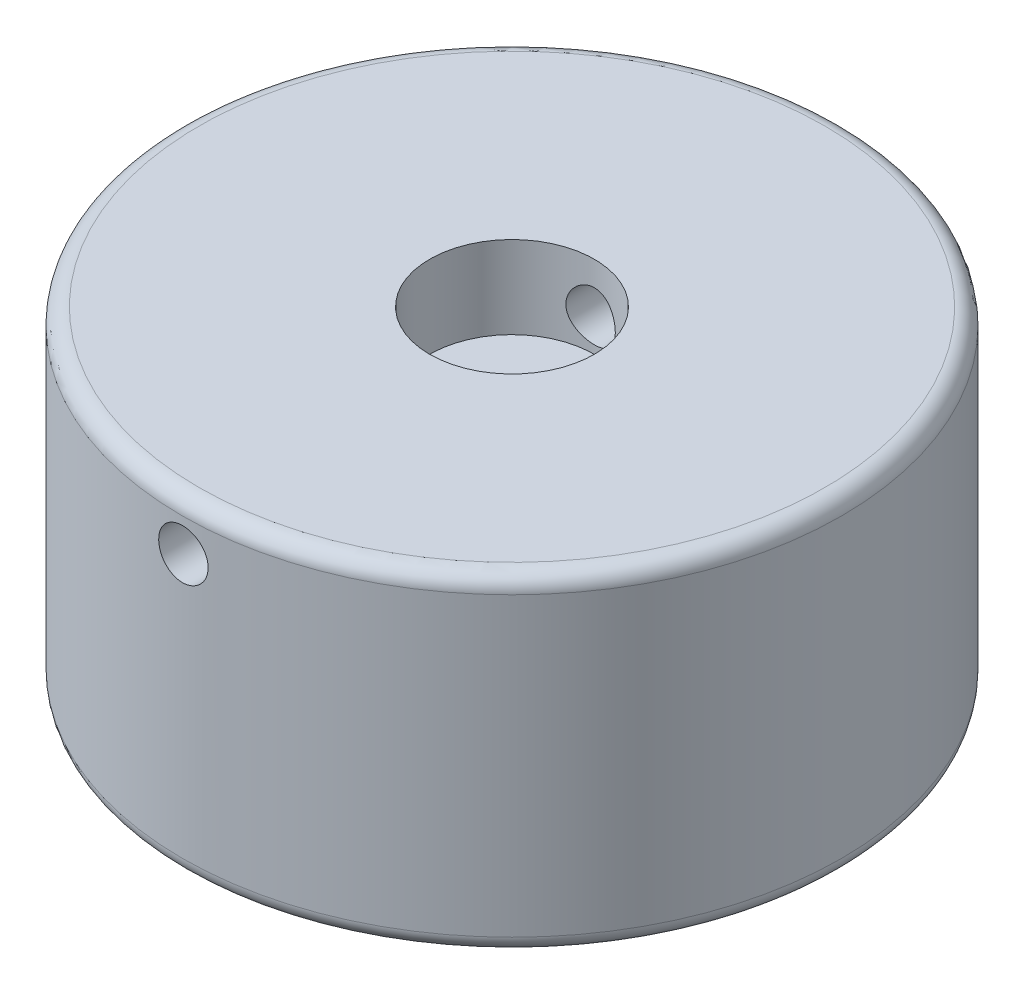
ISO-10303-21;
HEADER;
FILE_DESCRIPTION(('STEP AP214'),'2;1');
FILE_NAME('part.step','',(''),(''),'','','');
FILE_SCHEMA(('AUTOMOTIVE_DESIGN { 1 0 10303 214 1 1 1 1 }'));
ENDSEC;
DATA;
#1=APPLICATION_CONTEXT('core data for automotive mechanical design processes');
#2=APPLICATION_PROTOCOL_DEFINITION('international standard','automotive_design',2000,#1);
#3=PRODUCT_CONTEXT('',#1,'mechanical');
#4=PRODUCT('Part','Part','',(#3));
#5=PRODUCT_RELATED_PRODUCT_CATEGORY('part','',(#4));
#6=PRODUCT_DEFINITION_FORMATION('','',#4);
#7=PRODUCT_DEFINITION_CONTEXT('part definition',#1,'design');
#8=PRODUCT_DEFINITION('design','',#6,#7);
#9=PRODUCT_DEFINITION_SHAPE('','',#8);
#10=(LENGTH_UNIT() NAMED_UNIT(*) SI_UNIT(.MILLI.,.METRE.));
#11=(NAMED_UNIT(*) PLANE_ANGLE_UNIT() SI_UNIT($,.RADIAN.));
#12=(NAMED_UNIT(*) SI_UNIT($,.STERADIAN.) SOLID_ANGLE_UNIT());
#13=UNCERTAINTY_MEASURE_WITH_UNIT(LENGTH_MEASURE(1.E-05),#10,'distance_accuracy_value','');
#14=(GEOMETRIC_REPRESENTATION_CONTEXT(3) GLOBAL_UNCERTAINTY_ASSIGNED_CONTEXT((#13)) GLOBAL_UNIT_ASSIGNED_CONTEXT((#10,
#11,#12)) REPRESENTATION_CONTEXT('',''));
#15=CARTESIAN_POINT('',(0.,0.,0.));
#16=DIRECTION('',(0.,0.,1.));
#17=DIRECTION('',(1.,0.,0.));
#18=AXIS2_PLACEMENT_3D('',#15,#16,#17);
#19=CARTESIAN_POINT('',(0.,20.,0.));
#20=DIRECTION('',(0.,-1.,0.));
#21=DIRECTION('',(0.,0.,-1.));
#22=AXIS2_PLACEMENT_3D('',#19,#20,#21);
#23=CYLINDRICAL_SURFACE('',#22,20.);
#24=CARTESIAN_POINT('',(0.,19.,0.));
#25=DIRECTION('',(0.,1.,0.));
#26=DIRECTION('',(0.,0.,1.));
#27=AXIS2_PLACEMENT_3D('',#24,#25,#26);
#28=CIRCLE('',#27,20.);
#29=CARTESIAN_POINT('',(0.,19.,20.));
#30=VERTEX_POINT('',#29);
#31=EDGE_CURVE('E10',#30,#30,#28,.F.);
#32=ORIENTED_EDGE('',*,*,#31,.T.);
#33=EDGE_LOOP('',(#32));
#34=FACE_BOUND('',#33,.T.);
#35=CARTESIAN_POINT('',(0.,1.,0.));
#36=DIRECTION('',(0.,1.,0.));
#37=DIRECTION('',(0.,0.,1.));
#38=AXIS2_PLACEMENT_3D('',#35,#36,#37);
#39=CIRCLE('',#38,20.);
#40=CARTESIAN_POINT('',(0.,1.,20.));
#41=VERTEX_POINT('',#40);
#42=EDGE_CURVE('E46',#41,#41,#39,.T.);
#43=ORIENTED_EDGE('',*,*,#42,.T.);
#44=EDGE_LOOP('',(#43));
#45=FACE_BOUND('',#44,.T.);
#46=CARTESIAN_POINT('',(0.,18.5,-20.));
#47=CARTESIAN_POINT('',(-0.0841288095114436,18.499996313183,-19.9999992582729));
#48=CARTESIAN_POINT('',(-0.168315601024088,18.4928985465594,-19.9994635090758));
#49=CARTESIAN_POINT('',(-0.334361941971539,18.4646875154567,-19.9973778078798));
#50=CARTESIAN_POINT('',(-0.416218711162995,18.443558183763,-19.9958266932389));
#51=CARTESIAN_POINT('',(-0.575175965959819,18.3878966718803,-19.9918856268593));
#52=CARTESIAN_POINT('',(-0.652279036935093,18.3533718528915,-19.9894961359011));
#53=CARTESIAN_POINT('',(-0.799576480678021,18.2719120471363,-19.9841466247064));
#54=CARTESIAN_POINT('',(-0.869772371799852,18.224979796204,-19.9811867302827));
#55=CARTESIAN_POINT('',(-1.00142895753255,18.1199307794625,-19.975021868989));
#56=CARTESIAN_POINT('',(-1.06287322971853,18.0617934559158,-19.971816458291));
#57=CARTESIAN_POINT('',(-1.17514165369782,17.9360277026551,-19.9655255838438));
#58=CARTESIAN_POINT('',(-1.22596534904266,17.8683988652259,-19.9624401252546));
#59=CARTESIAN_POINT('',(-1.31560383874766,17.7254725451906,-19.9567335395977));
#60=CARTESIAN_POINT('',(-1.35440446810332,17.6501661549699,-19.954112961772));
#61=CARTESIAN_POINT('',(-1.41880489046782,17.4940846276562,-19.9496376121017));
#62=CARTESIAN_POINT('',(-1.44440487688688,17.4133095707074,-19.947782829037));
#63=CARTESIAN_POINT('',(-1.48163037657928,17.2487461075994,-19.9450525889002));
#64=CARTESIAN_POINT('',(-1.49328231044217,17.1649637091924,-19.9441752805014));
#65=CARTESIAN_POINT('',(-1.50236254574838,16.9966280467393,-19.9434933892539));
#66=CARTESIAN_POINT('',(-1.49979106810858,16.9120747946865,-19.943688789744));
#67=CARTESIAN_POINT('',(-1.48051934417569,16.7447781889461,-19.9451285636931));
#68=CARTESIAN_POINT('',(-1.46384775676394,16.6620315130358,-19.9463708093904));
#69=CARTESIAN_POINT('',(-1.4168935522692,16.5005143028844,-19.9497609519804));
#70=CARTESIAN_POINT('',(-1.38661082447336,16.4217438009912,-19.9519088562398));
#71=CARTESIAN_POINT('',(-1.31326167189701,16.2703232837612,-19.9568707353614));
#72=CARTESIAN_POINT('',(-1.27018232726496,16.1976795498232,-19.9596853828031));
#73=CARTESIAN_POINT('',(-1.17247213743423,16.0606433371351,-19.9656629459514));
#74=CARTESIAN_POINT('',(-1.11784110342877,15.9962509932777,-19.9688258673499));
#75=CARTESIAN_POINT('',(-0.998417278432273,15.8773787417564,-19.9751530336147));
#76=CARTESIAN_POINT('',(-0.933599700176313,15.8229237324053,-19.978317262423));
#77=CARTESIAN_POINT('',(-0.79572937593444,15.7256642364343,-19.9842830152099));
#78=CARTESIAN_POINT('',(-0.722676625718588,15.6828597557987,-19.9870845390023));
#79=CARTESIAN_POINT('',(-0.57039394021633,15.6101181697562,-19.9920096041928));
#80=CARTESIAN_POINT('',(-0.491163509428973,15.5801820977587,-19.994133091137));
#81=CARTESIAN_POINT('',(-0.328781652774538,15.5340441877952,-19.9974621500133));
#82=CARTESIAN_POINT('',(-0.245630292842568,15.5178421189623,-19.998667737375));
#83=CARTESIAN_POINT('',(-0.0779828437837463,15.4996631904611,-20.0000231735387));
#84=CARTESIAN_POINT('',(0.00650949482532519,15.4976519253458,-20.0001755757578));
#85=CARTESIAN_POINT('',(0.174630230993068,15.5078216680697,-19.9994142771364));
#86=CARTESIAN_POINT('',(0.258258635054601,15.5200025690053,-19.9985005843262));
#87=CARTESIAN_POINT('',(0.422180011176508,15.5581823688106,-19.9957115375324));
#88=CARTESIAN_POINT('',(0.502476701646074,15.5841653905587,-19.9938372886011));
#89=CARTESIAN_POINT('',(0.657570327384032,15.6491956936367,-19.989337809084));
#90=CARTESIAN_POINT('',(0.732367191799401,15.6882431432368,-19.9867125688255));
#91=CARTESIAN_POINT('',(0.874494959376764,15.7783808378979,-19.9809993255836));
#92=CARTESIAN_POINT('',(0.941811320255552,15.8294939567188,-19.9779104477497));
#93=CARTESIAN_POINT('',(1.06692059601702,15.9422789254691,-19.9716201639251));
#94=CARTESIAN_POINT('',(1.12471337673481,16.0039509241233,-19.9684187563498));
#95=CARTESIAN_POINT('',(1.22925234979154,16.1362519401321,-19.9622567375937));
#96=CARTESIAN_POINT('',(1.27597614708766,16.206898679433,-19.9592966224009));
#97=CARTESIAN_POINT('',(1.35689744472608,16.3550551983815,-19.9539590285433));
#98=CARTESIAN_POINT('',(1.39109504958689,16.4325649207578,-19.951581545017));
#99=CARTESIAN_POINT('',(1.44595479238458,16.5921668074873,-19.9476809567371));
#100=CARTESIAN_POINT('',(1.46663080672911,16.6742541798527,-19.9461569763152));
#101=CARTESIAN_POINT('',(1.49390569339177,16.8407472310157,-19.9441328652441));
#102=CARTESIAN_POINT('',(1.50050477907388,16.9251528746556,-19.9436327190765));
#103=CARTESIAN_POINT('',(1.49943621553155,17.0936639132474,-19.9437130691626));
#104=CARTESIAN_POINT('',(1.49180376085723,17.1777695348961,-19.9442908995857));
#105=CARTESIAN_POINT('',(1.46256198193398,17.34350108371,-19.9464564369575));
#106=CARTESIAN_POINT('',(1.44095263443385,17.4251270067498,-19.9480441455862));
#107=CARTESIAN_POINT('',(1.38437900273526,17.5835856084218,-19.952049853556));
#108=CARTESIAN_POINT('',(1.34941515840954,17.6604184448325,-19.9544678255495));
#109=CARTESIAN_POINT('',(1.26712924619683,17.8071289577146,-19.9598616237908));
#110=CARTESIAN_POINT('',(1.21980742681008,17.8770067740018,-19.9628374388208));
#111=CARTESIAN_POINT('',(1.11401708946727,18.008003349971,-19.9690203079162));
#112=CARTESIAN_POINT('',(1.05552268820001,18.0691011816401,-19.972227887963));
#113=CARTESIAN_POINT('',(0.929090973452715,18.1806340503108,-19.9785081329158));
#114=CARTESIAN_POINT('',(0.861151367795684,18.2310664915061,-19.9815807648333));
#115=CARTESIAN_POINT('',(0.717650416603836,18.3198911625391,-19.9872494022766));
#116=CARTESIAN_POINT('',(0.642077148267442,18.358264160491,-19.9898446437752));
#117=CARTESIAN_POINT('',(0.485593917915207,18.4217282844403,-19.9942566719576));
#118=CARTESIAN_POINT('',(0.404690263737662,18.4468348030683,-19.9960743603405));
#119=CARTESIAN_POINT('',(0.269417916724366,18.476601988527,-19.9982556200579));
#120=CARTESIAN_POINT('',(0.21592119293804,18.4853647187894,-19.9989068154638));
#121=CARTESIAN_POINT('',(0.108290987947988,18.4970649051523,-19.9997792437292));
#122=CARTESIAN_POINT('',(0.0541575080690676,18.5000023733704,-20.0000004774832));
#123=CARTESIAN_POINT('',(0.,18.5,-20.));
#124=B_SPLINE_CURVE_WITH_KNOTS('',3,(#46,#47,#48,#49,#50,#51,#52,#53,#54,#55,#56,#57,#58,#59,
#60,#61,#62,#63,#64,#65,#66,#67,#68,#69,#70,#71,#72,#73,#74,#75,#76,#77,#78,#79,#80,#81,#82,#83,
#84,#85,#86,#87,#88,#89,#90,#91,#92,#93,#94,#95,#96,#97,#98,#99,#100,#101,#102,#103,#104,#105,
#106,#107,#108,#109,#110,#111,#112,#113,#114,#115,#116,#117,#118,#119,#120,#121,#122,#123),
.UNSPECIFIED.,.T.,.F.,(4,2,2,2,2,2,2,2,2,2,2,2,2,2,2,2,2,2,2,2,2,2,2,2,2,2,2,2,2,2,2,2,2,2,2,2,
2,2,4),(0.,0.252188706341404,0.504666687116077,0.757006120137035,1.00928995874569,
1.26204114133441,1.51480318436673,1.76786189721255,2.02091690224424,2.27349180470371,
2.52606278420137,2.7781216361643,3.03018253840791,3.28249879898397,3.53481918386622,
3.78776333637314,4.04070761880368,4.29367221036428,4.54663254953899,4.79897937776532,
5.05132430518305,5.3033795769523,5.55543809532427,5.8079783521194,6.06052216631006,
6.31357265115638,6.56662102450255,6.81940930006921,7.07219374409737,7.32435388202406,
7.57651443943157,7.82866669184701,8.0808138742512,8.33355244628147,8.58635246072109,
8.83955360771712,9.09246032562225,9.25480590484756,9.41715114636384),.UNSPECIFIED.);
#125=CARTESIAN_POINT('',(0.,18.5,-20.));
#126=VERTEX_POINT('',#125);
#127=EDGE_CURVE('E83',#126,#126,#124,.T.);
#128=ORIENTED_EDGE('',*,*,#127,.T.);
#129=EDGE_LOOP('',(#128));
#130=FACE_BOUND('',#129,.T.);
#131=CARTESIAN_POINT('',(1.5,17.,19.9436706751791));
#132=CARTESIAN_POINT('',(1.49999631284401,16.9158715657221,19.9436714247109));
#133=CARTESIAN_POINT('',(1.49289860739439,16.8316851482054,19.9442087219975));
#134=CARTESIAN_POINT('',(1.46468784137981,16.6656395843521,19.9462999542358));
#135=CARTESIAN_POINT('',(1.44355871231829,16.583783218552,19.9478550547254));
#136=CARTESIAN_POINT('',(1.38789779324919,16.4248268165696,19.9518047691616));
#137=CARTESIAN_POINT('',(1.3533733740953,16.3477241916008,19.9541989213442));
#138=CARTESIAN_POINT('',(1.27191450979852,16.2004274945424,19.9595563959789));
#139=CARTESIAN_POINT('',(1.22498279950199,16.1302319046598,19.9625195929615));
#140=CARTESIAN_POINT('',(1.11993432781423,15.9985749762163,19.9686882981736));
#141=CARTESIAN_POINT('',(1.06179688800529,15.9371301561042,19.9718942476191));
#142=CARTESIAN_POINT('',(0.93603067250677,15.8248606753523,19.9781831621206));
#143=CARTESIAN_POINT('',(0.868401490593042,15.7740364694814,19.9812661219056));
#144=CARTESIAN_POINT('',(0.7254748712688,15.6843974479153,19.9869657395593));
#145=CARTESIAN_POINT('',(0.650168585461499,15.6455967029054,19.9895818495818));
#146=CARTESIAN_POINT('',(0.494087285156649,15.5811960378796,19.9940482820627));
#147=CARTESIAN_POINT('',(0.413312350227828,15.5555959258413,19.9958986156604));
#148=CARTESIAN_POINT('',(0.248749250367039,15.5183701606955,19.9986219399733));
#149=CARTESIAN_POINT('',(0.164967095353704,15.506718077022,19.9994967789682));
#150=CARTESIAN_POINT('',(-0.00336809130426505,15.4976374577758,20.0001767917244));
#151=CARTESIAN_POINT('',(-0.0879211110423924,15.5002087028849,19.9999819819792));
#152=CARTESIAN_POINT('',(-0.255218748149912,15.5194800608541,19.9985461791421));
#153=CARTESIAN_POINT('',(-0.337966660410974,15.5361517488421,19.9973072908106));
#154=CARTESIAN_POINT('',(-0.499486291412522,15.5831065838984,19.9939251552444));
#155=CARTESIAN_POINT('',(-0.578257978464622,15.6133898394246,19.9917819008036));
#156=CARTESIAN_POINT('',(-0.72967992384892,15.6867400801833,19.9868286111045));
#157=CARTESIAN_POINT('',(-0.802323960991478,15.729819861391,19.9840179089941));
#158=CARTESIAN_POINT('',(-0.939360594503045,15.8275309805923,19.978045787876));
#159=CARTESIAN_POINT('',(-1.00375305579813,15.8821625076431,19.9748843631288));
#160=CARTESIAN_POINT('',(-1.12262474222923,16.0015866796574,19.9685571200843));
#161=CARTESIAN_POINT('',(-1.17707916883749,16.0664040119159,19.9653913101349));
#162=CARTESIAN_POINT('',(-1.27433760665748,16.2042736373288,19.959419970567));
#163=CARTESIAN_POINT('',(-1.31714161069999,16.2773259355506,19.9566144411701));
#164=CARTESIAN_POINT('',(-1.38988285490415,16.4296085043748,19.9516806682916));
#165=CARTESIAN_POINT('',(-1.4198189134728,16.5088393415297,19.9495524870119));
#166=CARTESIAN_POINT('',(-1.46595667179795,16.6712220806093,19.9462154499794));
#167=CARTESIAN_POINT('',(-1.48215860485201,16.7543739159038,19.9450065786106));
#168=CARTESIAN_POINT('',(-1.50033702209464,16.9220215769075,19.9436474451507));
#169=CARTESIAN_POINT('',(-1.50234804014615,17.0065136380916,19.9434946131863));
#170=CARTESIAN_POINT('',(-1.49217790233958,17.1746337598505,19.9442580734706));
#171=CARTESIAN_POINT('',(-1.47999685337437,17.2582618269281,19.9451743576668));
#172=CARTESIAN_POINT('',(-1.4418171016997,17.4221815733563,19.9479704572233));
#173=CARTESIAN_POINT('',(-1.41583442327885,17.5024770057157,19.9498491550899));
#174=CARTESIAN_POINT('',(-1.35080522878805,17.6575682673738,19.9543574532934));
#175=CARTESIAN_POINT('',(-1.31175854243361,17.7323640249707,19.9569870634181));
#176=CARTESIAN_POINT('',(-1.2216219631562,17.8744910525573,19.9627071136634));
#177=CARTESIAN_POINT('',(-1.17050900238948,17.941807657102,19.9657984322502));
#178=CARTESIAN_POINT('',(-1.05772421033485,18.0669174982434,19.9720905549617));
#179=CARTESIAN_POINT('',(-0.996052231484175,18.1247106017266,19.975291360616));
#180=CARTESIAN_POINT('',(-0.863751071664404,18.2292502521079,19.9814493930731));
#181=CARTESIAN_POINT('',(-0.793104165808338,18.275974400694,19.9844061182321));
#182=CARTESIAN_POINT('',(-0.644947221990193,18.3568963150939,19.9897356262579));
#183=CARTESIAN_POINT('',(-0.567437241330211,18.3910941854814,19.9921084139996));
#184=CARTESIAN_POINT('',(-0.407835533992326,18.445954108355,19.9960003563777));
#185=CARTESIAN_POINT('',(-0.325748638943227,18.4666301522092,19.9975203931443));
#186=CARTESIAN_POINT('',(-0.159256592820331,18.4939052597001,19.9995391228448));
#187=CARTESIAN_POINT('',(-0.0748514764856434,18.5005045341642,20.0000378310751));
#188=CARTESIAN_POINT('',(0.0936599022297127,18.4994365127892,19.9999577474694));
#189=CARTESIAN_POINT('',(0.177766389716277,18.4918041854363,19.999381596669));
#190=CARTESIAN_POINT('',(0.343499701494935,18.4625623561685,19.9972217798986));
#191=CARTESIAN_POINT('',(0.425126521935541,18.4409528325451,19.9956381123638));
#192=CARTESIAN_POINT('',(0.583586891968923,18.3843785194567,19.9916410805027));
#193=CARTESIAN_POINT('',(0.66042059798129,18.3494141660817,19.989227743269));
#194=CARTESIAN_POINT('',(0.807132637033068,18.2671269672465,19.9838417849228));
#195=CARTESIAN_POINT('',(0.877011110424924,18.2198043712382,19.9808691750997));
#196=CARTESIAN_POINT('',(1.0080076253239,18.1140131892417,19.9746899428358));
#197=CARTESIAN_POINT('',(1.0691048813846,18.0555188968882,19.9714827914222));
#198=CARTESIAN_POINT('',(1.18063663968307,17.9290876354715,19.9652003844937));
#199=CARTESIAN_POINT('',(1.23106854462047,17.8611483729644,19.9621251612519));
#200=CARTESIAN_POINT('',(1.3198926494262,17.717647691718,19.9564494251809));
#201=CARTESIAN_POINT('',(1.35826551818871,17.6420742887965,19.9538496773175));
#202=CARTESIAN_POINT('',(1.42172936312997,17.4855907710643,19.9494287405787));
#203=CARTESIAN_POINT('',(1.44683573384081,17.4046869648977,19.9476066497794));
#204=CARTESIAN_POINT('',(1.47660249533123,17.2694150148451,19.9454198272495));
#205=CARTESIAN_POINT('',(1.48536503492032,17.2159188699986,19.9447668737592));
#206=CARTESIAN_POINT('',(1.49706496792379,17.1082898253435,19.9438920569245));
#207=CARTESIAN_POINT('',(1.50000237357368,17.0541569268725,19.9436701926747));
#208=CARTESIAN_POINT('',(1.5,17.,19.9436706751791));
#209=B_SPLINE_CURVE_WITH_KNOTS('',3,(#131,#132,#133,#134,#135,#136,#137,#138,#139,#140,#141,
#142,#143,#144,#145,#146,#147,#148,#149,#150,#151,#152,#153,#154,#155,#156,#157,#158,#159,#160,
#161,#162,#163,#164,#165,#166,#167,#168,#169,#170,#171,#172,#173,#174,#175,#176,#177,#178,#179,
#180,#181,#182,#183,#184,#185,#186,#187,#188,#189,#190,#191,#192,#193,#194,#195,#196,#197,#198,
#199,#200,#201,#202,#203,#204,#205,#206,#207,#208),.UNSPECIFIED.,.T.,.F.,(4,2,2,2,2,2,2,2,2,2,2,
2,2,2,2,2,2,2,2,2,2,2,2,2,2,2,2,2,2,2,2,2,2,2,2,2,2,2,4),(0.,0.252187579339044,
0.504664457860796,0.757002605762189,1.00928517896143,1.26203783609002,1.5148013137358,
1.76785948521026,2.02091397548468,2.27348818174161,2.52605849341277,2.7781208625958,
3.03018524026398,3.28250252487075,3.53482393925044,3.7877666140638,4.04070944452772,
4.29367549638821,4.54663725110237,4.79898320559482,5.0513272594613,5.30337896930957,
5.55543396468602,5.8079747882566,6.06051914138529,6.31357024084872,6.5666192277034,
6.8194059624945,7.07218891127966,7.32435156508922,7.57651461054473,7.82866942254427,
8.08081914517807,8.33355621784139,8.58635476809665,8.83955652118654,9.09246380844973,
9.25480764733517,9.41715114522216),.UNSPECIFIED.);
#210=CARTESIAN_POINT('',(1.5,17.,19.9436706751791));
#211=VERTEX_POINT('',#210);
#212=EDGE_CURVE('E59',#211,#211,#209,.T.);
#213=ORIENTED_EDGE('',*,*,#212,.T.);
#214=EDGE_LOOP('',(#213));
#215=FACE_BOUND('',#214,.T.);
#216=ADVANCED_FACE('F31',(#34,#45,#130,#215),#23,.T.);
#217=CARTESIAN_POINT('',(0.,20.,0.));
#218=DIRECTION('',(0.,1.,0.));
#219=DIRECTION('',(0.,0.,1.));
#220=AXIS2_PLACEMENT_3D('',#217,#218,#219);
#221=PLANE('',#220);
#222=CARTESIAN_POINT('',(0.,20.,0.));
#223=DIRECTION('',(0.,1.,0.));
#224=DIRECTION('',(0.,0.,1.));
#225=AXIS2_PLACEMENT_3D('',#222,#223,#224);
#226=CIRCLE('',#225,19.);
#227=CARTESIAN_POINT('',(0.,20.,19.));
#228=VERTEX_POINT('',#227);
#229=EDGE_CURVE('E38',#228,#228,#226,.T.);
#230=ORIENTED_EDGE('',*,*,#229,.T.);
#231=EDGE_LOOP('',(#230));
#232=FACE_BOUND('',#231,.T.);
#233=CARTESIAN_POINT('',(0.,20.,0.));
#234=DIRECTION('',(0.,1.,0.));
#235=DIRECTION('',(0.,0.,1.));
#236=AXIS2_PLACEMENT_3D('',#233,#234,#235);
#237=CIRCLE('',#236,5.);
#238=CARTESIAN_POINT('',(0.,20.,5.));
#239=VERTEX_POINT('',#238);
#240=EDGE_CURVE('E113',#239,#239,#237,.T.);
#241=ORIENTED_EDGE('',*,*,#240,.F.);
#242=EDGE_LOOP('',(#241));
#243=FACE_BOUND('',#242,.T.);
#244=ADVANCED_FACE('F90',(#232,#243),#221,.T.);
#245=CARTESIAN_POINT('',(0.,0.,0.));
#246=DIRECTION('',(0.,1.,0.));
#247=DIRECTION('',(0.,0.,1.));
#248=AXIS2_PLACEMENT_3D('',#245,#246,#247);
#249=PLANE('',#248);
#250=CARTESIAN_POINT('',(0.,0.,0.));
#251=DIRECTION('',(0.,1.,0.));
#252=DIRECTION('',(0.,0.,1.));
#253=AXIS2_PLACEMENT_3D('',#250,#251,#252);
#254=CIRCLE('',#253,19.);
#255=CARTESIAN_POINT('',(0.,0.,19.));
#256=VERTEX_POINT('',#255);
#257=EDGE_CURVE('E42',#256,#256,#254,.F.);
#258=ORIENTED_EDGE('',*,*,#257,.T.);
#259=EDGE_LOOP('',(#258));
#260=FACE_BOUND('',#259,.T.);
#261=ADVANCED_FACE('F91',(#260),#249,.F.);
#262=CARTESIAN_POINT('',(0.,15.,0.));
#263=DIRECTION('',(0.,1.,0.));
#264=DIRECTION('',(0.,0.,1.));
#265=AXIS2_PLACEMENT_3D('',#262,#263,#264);
#266=CYLINDRICAL_SURFACE('',#265,5.);
#267=CARTESIAN_POINT('',(0.,15.5,5.));
#268=CARTESIAN_POINT('',(0.0822886127533,15.5000009974849,4.9999992925055));
#269=CARTESIAN_POINT('',(0.16458731835153,15.506793863624,4.99794915693954));
#270=CARTESIAN_POINT('',(0.326788125304881,15.5337213542221,4.98997105593691));
#271=CARTESIAN_POINT('',(0.40668950441142,15.5538599580233,4.98404193389692));
#272=CARTESIAN_POINT('',(0.561732707754527,15.6067460169103,4.96895552501836));
#273=CARTESIAN_POINT('',(0.636881364395374,15.6394748696189,4.95980300250425));
#274=CARTESIAN_POINT('',(0.780624181053132,15.7165360930558,4.93922109237645));
#275=CARTESIAN_POINT('',(0.84921746746967,15.7608700073954,4.92779140192067));
#276=CARTESIAN_POINT('',(0.979871797183746,15.8612240074727,4.90350737192774));
#277=CARTESIAN_POINT('',(1.04171807124434,15.9175166258859,4.89062383657036));
#278=CARTESIAN_POINT('',(1.15524920923324,16.0396092299102,4.86505834210442));
#279=CARTESIAN_POINT('',(1.20693236327441,16.105410812125,4.85237641724501));
#280=CARTESIAN_POINT('',(1.29980037723708,16.2464707530376,4.82834113993772));
#281=CARTESIAN_POINT('',(1.34072309022214,16.3219084609907,4.81702406663875));
#282=CARTESIAN_POINT('',(1.40921394774761,16.4789892542303,4.79743620394031));
#283=CARTESIAN_POINT('',(1.43678529919973,16.560630843928,4.78916468313311));
#284=CARTESIAN_POINT('',(1.47701633682652,16.7253902661305,4.77690870838434));
#285=CARTESIAN_POINT('',(1.49007196234678,16.8084027438639,4.77281069324533));
#286=CARTESIAN_POINT('',(1.50213730614672,16.9755331562168,4.76902789749767));
#287=CARTESIAN_POINT('',(1.50115042761078,17.0596508180591,4.76934204760571));
#288=CARTESIAN_POINT('',(1.48546977199812,17.2233839086085,4.77424744067778));
#289=CARTESIAN_POINT('',(1.47127205262685,17.3030522503622,4.7786838859914));
#290=CARTESIAN_POINT('',(1.43037420427056,17.4588197862735,4.79108356228624));
#291=CARTESIAN_POINT('',(1.40367284141641,17.5349186273743,4.79904714132351));
#292=CARTESIAN_POINT('',(1.33816026653682,17.6826003496607,4.81772733074973));
#293=CARTESIAN_POINT('',(1.29918816934642,17.7541070839553,4.82848016115952));
#294=CARTESIAN_POINT('',(1.21035222588683,17.8897320220102,4.85150987000064));
#295=CARTESIAN_POINT('',(1.16048574002588,17.9538484294138,4.86378711746991));
#296=CARTESIAN_POINT('',(1.04881290765547,18.075686190762,4.88911011297937));
#297=CARTESIAN_POINT('',(0.986594907466974,18.1330286640297,4.90216654310498));
#298=CARTESIAN_POINT('',(0.853263259313967,18.2365539840643,4.92712244063259));
#299=CARTESIAN_POINT('',(0.782149051860887,18.2827361284144,4.9390218351841));
#300=CARTESIAN_POINT('',(0.632355038342801,18.3628599224647,4.9604316006947));
#301=CARTESIAN_POINT('',(0.553627749747949,18.3967175162499,4.96992543668314));
#302=CARTESIAN_POINT('',(0.391245415603518,18.4505995900996,4.98533521832222));
#303=CARTESIAN_POINT('',(0.30759175158958,18.4706279285325,4.99125216186999));
#304=CARTESIAN_POINT('',(0.14095224266833,18.4956521778994,4.99868364643538));
#305=CARTESIAN_POINT('',(0.0580500976011861,18.5011615858016,5.0003485041779));
#306=CARTESIAN_POINT('',(-0.107499605823384,18.4984308442879,4.9995292324176));
#307=CARTESIAN_POINT('',(-0.190147196690781,18.4901925303486,4.99704565677756));
#308=CARTESIAN_POINT('',(-0.350903605309697,18.4606153888885,4.98830696987163));
#309=CARTESIAN_POINT('',(-0.42907277261417,18.4395766124191,4.98213829799417));
#310=CARTESIAN_POINT('',(-0.580754638954523,18.3853567672218,4.96674347841533));
#311=CARTESIAN_POINT('',(-0.654266777025585,18.3521742389621,4.95751696321085));
#312=CARTESIAN_POINT('',(-0.796437189461054,18.2737468345189,4.93669654351325));
#313=CARTESIAN_POINT('',(-0.86494382619967,18.228240659052,4.92505280829675));
#314=CARTESIAN_POINT('',(-0.993523307980148,18.1267752459472,4.90073468764317));
#315=CARTESIAN_POINT('',(-1.05359403235594,18.0708133881123,4.8880600443108));
#316=CARTESIAN_POINT('',(-1.16585744551027,17.9476126916307,4.86253171869138));
#317=CARTESIAN_POINT('',(-1.21768481231504,17.8800381242283,4.84968825033268));
#318=CARTESIAN_POINT('',(-1.30928995072154,17.7368720609865,4.82576515238463));
#319=CARTESIAN_POINT('',(-1.34906803829472,17.6612807754418,4.81468547654651));
#320=CARTESIAN_POINT('',(-1.41517347127168,17.5044675087453,4.79567189615055));
#321=CARTESIAN_POINT('',(-1.4415634693705,17.4232738134634,4.78772337843827));
#322=CARTESIAN_POINT('',(-1.48021730815114,17.2573120310685,4.77591594362794));
#323=CARTESIAN_POINT('',(-1.49248598978779,17.1725451792123,4.772055625083));
#324=CARTESIAN_POINT('',(-1.50221984485059,17.0056384816238,4.76899972496087));
#325=CARTESIAN_POINT('',(-1.5002805530849,16.9235363489824,4.76961647442754));
#326=CARTESIAN_POINT('',(-1.48307505444813,16.7608858966272,4.77499401288294));
#327=CARTESIAN_POINT('',(-1.46780938124716,16.6803375148236,4.77975463592551));
#328=CARTESIAN_POINT('',(-1.42476888804136,16.5240546008571,4.79275763670385));
#329=CARTESIAN_POINT('',(-1.39715175507068,16.4482727126383,4.80095604545965));
#330=CARTESIAN_POINT('',(-1.33031507121129,16.3023575611823,4.81990278909136));
#331=CARTESIAN_POINT('',(-1.29109329962876,16.2322253823592,4.83065161194312));
#332=CARTESIAN_POINT('',(-1.20048763805072,16.0968368834729,4.85397676425833));
#333=CARTESIAN_POINT('',(-1.14871276092994,16.0318512387396,4.86660540163798));
#334=CARTESIAN_POINT('',(-1.03517434629782,15.9112975016921,4.89201320450026));
#335=CARTESIAN_POINT('',(-0.9734082171345,15.8557318605322,4.90479240823905));
#336=CARTESIAN_POINT('',(-0.839465762183246,15.753976587705,4.92950936570649));
#337=CARTESIAN_POINT('',(-0.767037885790605,15.7081085531445,4.94141159765674));
#338=CARTESIAN_POINT('',(-0.615141373983527,15.629264830096,4.96260680455813));
#339=CARTESIAN_POINT('',(-0.535676052998953,15.5962831117255,4.97190099931066));
#340=CARTESIAN_POINT('',(-0.38075771265528,15.5471047243472,4.98602174969301));
#341=CARTESIAN_POINT('',(-0.305786961954232,15.5294883271168,4.99122027381068));
#342=CARTESIAN_POINT('',(-0.153880195230778,15.5059364747584,4.99820944494492));
#343=CARTESIAN_POINT('',(-0.076944509858139,15.4999990672952,5.0000006615474));
#344=CARTESIAN_POINT('',(0.,15.5,5.));
#345=B_SPLINE_CURVE_WITH_KNOTS('',3,(#267,#268,#269,#270,#271,#272,#273,#274,#275,#276,#277,
#278,#279,#280,#281,#282,#283,#284,#285,#286,#287,#288,#289,#290,#291,#292,#293,#294,#295,#296,
#297,#298,#299,#300,#301,#302,#303,#304,#305,#306,#307,#308,#309,#310,#311,#312,#313,#314,#315,
#316,#317,#318,#319,#320,#321,#322,#323,#324,#325,#326,#327,#328,#329,#330,#331,#332,#333,#334,
#335,#336,#337,#338,#339,#340,#341,#342,#343,#344),.UNSPECIFIED.,.T.,.F.,(4,2,2,2,2,2,2,2,2,2,2,
2,2,2,2,2,2,2,2,2,2,2,2,2,2,2,2,2,2,2,2,2,2,2,2,2,2,2,4),(0.,0.246583203612611,0.493239964846,
0.739533676300875,0.985860164412703,1.23855602948192,1.49129437288633,1.74971481004109,
2.00807314543224,2.25919689356599,2.5102597831909,2.75226016697677,2.99428443658002,
3.2396242644712,3.48502360158556,3.74067104048167,3.99633456531072,4.25371046881689,
4.51101453528808,4.75908809438546,5.00712853550327,5.24956746682327,5.49203554593729,
5.74011305702909,5.98825282000191,6.24540400322819,6.50254844252681,6.75847814951252,
7.01432009460284,7.25950155466943,7.504673196616,7.74680040402722,7.98897397553108,
8.23996925679931,8.49102974897503,8.74942996156672,9.00770911595236,9.2383169193046,
9.46888616948875),.UNSPECIFIED.);
#346=CARTESIAN_POINT('',(0.,15.5,5.));
#347=VERTEX_POINT('',#346);
#348=EDGE_CURVE('E52',#347,#347,#345,.T.);
#349=ORIENTED_EDGE('',*,*,#348,.T.);
#350=EDGE_LOOP('',(#349));
#351=FACE_BOUND('',#350,.T.);
#352=CARTESIAN_POINT('',(1.5,17.,-4.76969600708473));
#353=CARTESIAN_POINT('',(1.49999897633764,16.9178054520576,-4.7696968572698));
#354=CARTESIAN_POINT('',(1.49322108167142,16.835600775856,-4.77184390209069));
#355=CARTESIAN_POINT('',(1.46635844446749,16.6735947504081,-4.780165783029));
#356=CARTESIAN_POINT('',(1.44626925573578,16.5937942134985,-4.78634196493468));
#357=CARTESIAN_POINT('',(1.39352753269955,16.4389652717283,-4.80196102485632));
#358=CARTESIAN_POINT('',(1.36089589394244,16.3639291703669,-4.81139846703232));
#359=CARTESIAN_POINT('',(1.28406421917929,16.2203780660047,-4.83246932547567));
#360=CARTESIAN_POINT('',(1.23986245137053,16.1518640413156,-4.8441030704102));
#361=CARTESIAN_POINT('',(1.13964754141627,16.0211336094226,-4.86866862185766));
#362=CARTESIAN_POINT('',(1.08333207175807,15.9591541020537,-4.88162808311636));
#363=CARTESIAN_POINT('',(0.961136237579599,15.8453620486775,-4.90714861936757));
#364=CARTESIAN_POINT('',(0.895254645461111,15.7935508095501,-4.91970964297705));
#365=CARTESIAN_POINT('',(0.754111437793689,15.7005373001667,-4.94333214579389));
#366=CARTESIAN_POINT('',(0.678684021335814,15.6595765755572,-4.95435724342404));
#367=CARTESIAN_POINT('',(0.521624645369354,15.5910127409572,-4.97334435920684));
#368=CARTESIAN_POINT('',(0.439994028387912,15.5634067501426,-4.98130703789495));
#369=CARTESIAN_POINT('',(0.275323852630829,15.5231199989095,-4.99307646003589));
#370=CARTESIAN_POINT('',(0.1923913989538,15.5100348723473,-4.99699557369338));
#371=CARTESIAN_POINT('',(0.0254218237493145,15.4978826753536,-5.00063201501348));
#372=CARTESIAN_POINT('',(-0.0586150620503688,15.498812660598,-5.00035022521079));
#373=CARTESIAN_POINT('',(-0.222571156600161,15.514392868543,-4.99569603817659));
#374=CARTESIAN_POINT('',(-0.302536267641342,15.5286051938099,-4.9914542020526));
#375=CARTESIAN_POINT('',(-0.458889213442527,15.5696313359943,-4.97951522112593));
#376=CARTESIAN_POINT('',(-0.535276821322847,15.5964459509427,-4.97181785750586));
#377=CARTESIAN_POINT('',(-0.683347326351282,15.6622120234186,-4.95365220986963));
#378=CARTESIAN_POINT('',(-0.75496506469448,15.7013012028073,-4.94315269676706));
#379=CARTESIAN_POINT('',(-0.890764673783158,15.7903978524282,-4.92049640648069));
#380=CARTESIAN_POINT('',(-0.954944774872132,15.8404079129635,-4.90833923637778));
#381=CARTESIAN_POINT('',(-1.0766604815298,15.9521977507516,-4.88311550488165));
#382=CARTESIAN_POINT('',(-1.13384458040112,16.0143569190297,-4.87003195321461));
#383=CARTESIAN_POINT('',(-1.23707651539824,16.1475100178901,-4.84483979887497));
#384=CARTESIAN_POINT('',(-1.28312324482853,16.2185048253892,-4.8327312931702));
#385=CARTESIAN_POINT('',(-1.3631399533545,16.368239469249,-4.81077903197678));
#386=CARTESIAN_POINT('',(-1.39698989237679,16.4470470458629,-4.80095810695957));
#387=CARTESIAN_POINT('',(-1.45083362878413,16.6096072084455,-4.78496392548436));
#388=CARTESIAN_POINT('',(-1.4708319464056,16.6933581715346,-4.7787894791583));
#389=CARTESIAN_POINT('',(-1.49574770282165,16.8600823607393,-4.77104849541241));
#390=CARTESIAN_POINT('',(-1.50119946380212,16.942968223894,-4.7693187867044));
#391=CARTESIAN_POINT('',(-1.49835947233062,17.1084729000099,-4.77021192441924));
#392=CARTESIAN_POINT('',(-1.4900696437133,17.1910917487309,-4.77283416156589));
#393=CARTESIAN_POINT('',(-1.4604576357419,17.3514883779709,-4.78197558554912));
#394=CARTESIAN_POINT('',(-1.4394796143128,17.4293361642635,-4.78839176507489));
#395=CARTESIAN_POINT('',(-1.3854857774794,17.5804016908149,-4.80429141231227));
#396=CARTESIAN_POINT('',(-1.35246810342759,17.6536187141406,-4.81377535359073));
#397=CARTESIAN_POINT('',(-1.274318711965,17.7955174640721,-4.83505835023047));
#398=CARTESIAN_POINT('',(-1.22888564172729,17.8640247209858,-4.84691271069799));
#399=CARTESIAN_POINT('',(-1.12755301600385,17.9926381061808,-4.87148205646987));
#400=CARTESIAN_POINT('',(-1.07165095534897,18.0527422176128,-4.88419724730003));
#401=CARTESIAN_POINT('',(-0.948455132493598,18.1651804058147,-4.90963633548158));
#402=CARTESIAN_POINT('',(-0.880811065857434,18.217135628987,-4.92234245063004));
#403=CARTESIAN_POINT('',(-0.737461784590248,18.3089667010278,-4.94584851748651));
#404=CARTESIAN_POINT('',(-0.661756970543942,18.3488431497815,-4.95664856384717));
#405=CARTESIAN_POINT('',(-0.504935504705219,18.4150000305683,-4.97505970474957));
#406=CARTESIAN_POINT('',(-0.423864622037837,18.441382016159,-4.98269453424966));
#407=CARTESIAN_POINT('',(-0.258169966504586,18.4800609188904,-4.99401979596827));
#408=CARTESIAN_POINT('',(-0.17354721735476,18.4923618659484,-4.9977113567088));
#409=CARTESIAN_POINT('',(-0.00665215388274042,18.5022230440545,-5.00066544081399));
#410=CARTESIAN_POINT('',(0.0755851790862087,18.5003326954078,-5.00009305111322));
#411=CARTESIAN_POINT('',(0.238519481164406,18.4831783675009,-4.99497264465037));
#412=CARTESIAN_POINT('',(0.31921653734653,18.4679151465196,-4.99042485330462));
#413=CARTESIAN_POINT('',(0.47593581304136,18.4247883386004,-4.97791168358327));
#414=CARTESIAN_POINT('',(0.551998927351394,18.397061819351,-4.96998352900866));
#415=CARTESIAN_POINT('',(0.698433237752055,18.3299180854928,-4.9515294303945));
#416=CARTESIAN_POINT('',(0.768803496050582,18.2904989497138,-4.94100305949946));
#417=CARTESIAN_POINT('',(0.904301892420566,18.19962654257,-4.91803965828228));
#418=CARTESIAN_POINT('',(0.96919025007677,18.1478285699992,-4.90555226923559));
#419=CARTESIAN_POINT('',(1.08953757134595,18.0342896116672,-4.88023537212334));
#420=CARTESIAN_POINT('',(1.14499380960194,17.9725457621018,-4.86740576641079));
#421=CARTESIAN_POINT('',(1.24656269394549,17.8386592216895,-4.84240680631319));
#422=CARTESIAN_POINT('',(1.29234759757957,17.7662614466096,-4.83026852693485));
#423=CARTESIAN_POINT('',(1.37104313528776,17.614444825839,-4.80852547508793));
#424=CARTESIAN_POINT('',(1.40395995557289,17.5350293763988,-4.79891948596956));
#425=CARTESIAN_POINT('',(1.4530194253295,17.3802595683937,-4.78427816717595));
#426=CARTESIAN_POINT('',(1.47058859011232,17.305391353069,-4.7788615484052));
#427=CARTESIAN_POINT('',(1.49407818835144,17.1536847775042,-4.77157042597167));
#428=CARTESIAN_POINT('',(1.50000095706095,17.0768468153548,-4.7696952122143));
#429=CARTESIAN_POINT('',(1.5,17.,-4.76969600708473));
#430=B_SPLINE_CURVE_WITH_KNOTS('',3,(#352,#353,#354,#355,#356,#357,#358,#359,#360,#361,#362,
#363,#364,#365,#366,#367,#368,#369,#370,#371,#372,#373,#374,#375,#376,#377,#378,#379,#380,#381,
#382,#383,#384,#385,#386,#387,#388,#389,#390,#391,#392,#393,#394,#395,#396,#397,#398,#399,#400,
#401,#402,#403,#404,#405,#406,#407,#408,#409,#410,#411,#412,#413,#414,#415,#416,#417,#418,#419,
#420,#421,#422,#423,#424,#425,#426,#427,#428,#429),.UNSPECIFIED.,.T.,.F.,(4,2,2,2,2,2,2,2,2,2,2,
2,2,2,2,2,2,2,2,2,2,2,2,2,2,2,2,2,2,2,2,2,2,2,2,2,2,2,4),(0.,0.246300165915545,
0.492682641689001,0.738656414466191,0.984667025370103,1.23773150007984,1.49082847871273,
1.74915939273645,2.00743455587877,2.25832140149558,2.50915554101441,2.7520012599088,
2.99486235890376,3.24055209335677,3.48630016590831,3.74152147023278,3.99676812491863,
4.25446238246266,4.51207250628412,4.7600808079031,5.00805439107388,5.24958594938817,
5.49115481045788,5.73920731809389,5.98731925928923,6.24479506100603,6.50225807324203,
6.75775391814325,7.01317662321683,7.25876303911221,7.50433553047755,7.7472709687222,
7.99024634491379,8.24099627054489,8.49181852629891,8.75011639669148,9.00828993963945,
9.23861153857448,9.46888695033561),.UNSPECIFIED.);
#431=CARTESIAN_POINT('',(1.5,17.,-4.76969600708473));
#432=VERTEX_POINT('',#431);
#433=EDGE_CURVE('E60',#432,#432,#430,.T.);
#434=ORIENTED_EDGE('',*,*,#433,.T.);
#435=EDGE_LOOP('',(#434));
#436=FACE_BOUND('',#435,.T.);
#437=CARTESIAN_POINT('',(0.,15.,0.));
#438=DIRECTION('',(0.,1.,0.));
#439=DIRECTION('',(0.,0.,1.));
#440=AXIS2_PLACEMENT_3D('',#437,#438,#439);
#441=CIRCLE('',#440,5.);
#442=CARTESIAN_POINT('',(0.,15.,5.));
#443=VERTEX_POINT('',#442);
#444=EDGE_CURVE('E51',#443,#443,#441,.T.);
#445=ORIENTED_EDGE('',*,*,#444,.F.);
#446=EDGE_LOOP('',(#445));
#447=FACE_BOUND('',#446,.T.);
#448=ORIENTED_EDGE('',*,*,#240,.T.);
#449=EDGE_LOOP('',(#448));
#450=FACE_BOUND('',#449,.T.);
#451=ADVANCED_FACE('F64',(#351,#436,#447,#450),#266,.F.);
#452=CARTESIAN_POINT('',(0.,15.,0.));
#453=DIRECTION('',(0.,1.,0.));
#454=DIRECTION('',(0.,0.,1.));
#455=AXIS2_PLACEMENT_3D('',#452,#453,#454);
#456=PLANE('',#455);
#457=ORIENTED_EDGE('',*,*,#444,.T.);
#458=EDGE_LOOP('',(#457));
#459=FACE_BOUND('',#458,.T.);
#460=ADVANCED_FACE('F72',(#459),#456,.T.);
#461=CARTESIAN_POINT('',(0.,17.,-20.));
#462=DIRECTION('',(0.,0.,1.));
#463=DIRECTION('',(1.,0.,0.));
#464=AXIS2_PLACEMENT_3D('',#461,#462,#463);
#465=CYLINDRICAL_SURFACE('',#464,1.5);
#466=ORIENTED_EDGE('',*,*,#433,.F.);
#467=EDGE_LOOP('',(#466));
#468=FACE_BOUND('',#467,.T.);
#469=ORIENTED_EDGE('',*,*,#127,.F.);
#470=EDGE_LOOP('',(#469));
#471=FACE_BOUND('',#470,.T.);
#472=ADVANCED_FACE('F68',(#468,#471),#465,.F.);
#473=ORIENTED_EDGE('',*,*,#348,.F.);
#474=EDGE_LOOP('',(#473));
#475=FACE_BOUND('',#474,.T.);
#476=ORIENTED_EDGE('',*,*,#212,.F.);
#477=EDGE_LOOP('',(#476));
#478=FACE_BOUND('',#477,.T.);
#479=ADVANCED_FACE('F71',(#475,#478),#465,.F.);
#480=CARTESIAN_POINT('',(0.,1.,0.));
#481=DIRECTION('',(0.,1.,0.));
#482=DIRECTION('',(0.,0.,1.));
#483=AXIS2_PLACEMENT_3D('',#480,#481,#482);
#484=TOROIDAL_SURFACE('',#483,19.,1.);
#485=ORIENTED_EDGE('',*,*,#257,.F.);
#486=EDGE_LOOP('',(#485));
#487=FACE_BOUND('',#486,.T.);
#488=ORIENTED_EDGE('',*,*,#42,.F.);
#489=EDGE_LOOP('',(#488));
#490=FACE_BOUND('',#489,.T.);
#491=ADVANCED_FACE('F92',(#487,#490),#484,.T.);
#492=CARTESIAN_POINT('',(0.,19.,0.));
#493=DIRECTION('',(0.,1.,0.));
#494=DIRECTION('',(0.,0.,1.));
#495=AXIS2_PLACEMENT_3D('',#492,#493,#494);
#496=TOROIDAL_SURFACE('',#495,19.,1.);
#497=ORIENTED_EDGE('',*,*,#31,.F.);
#498=EDGE_LOOP('',(#497));
#499=FACE_BOUND('',#498,.T.);
#500=ORIENTED_EDGE('',*,*,#229,.F.);
#501=EDGE_LOOP('',(#500));
#502=FACE_BOUND('',#501,.T.);
#503=ADVANCED_FACE('F33',(#499,#502),#496,.T.);
#504=CLOSED_SHELL('',(#216,#244,#261,#451,#460,#472,#479,#491,#503));
#505=MANIFOLD_SOLID_BREP('B2',#504);
#506=ADVANCED_BREP_SHAPE_REPRESENTATION('',(#18,#505),#14);
#507=SHAPE_DEFINITION_REPRESENTATION(#9,#506);
ENDSEC;
END-ISO-10303-21;
